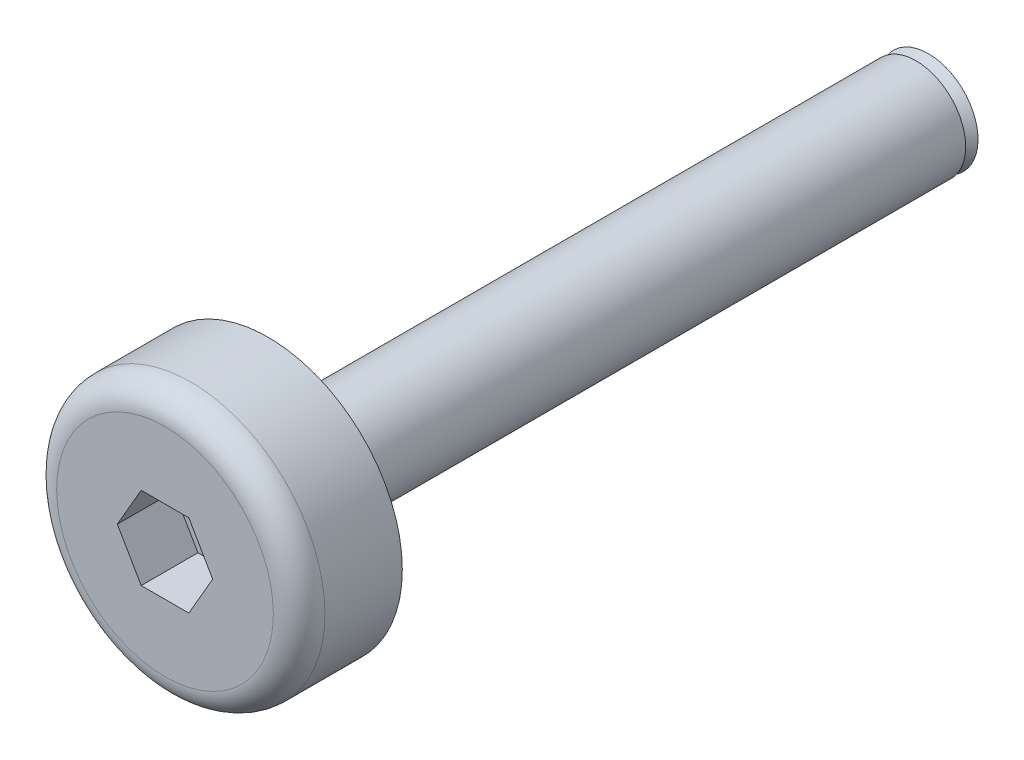
ISO-10303-21;
HEADER;
FILE_DESCRIPTION(('STEP AP214'),'2;1');
FILE_NAME('part.step','',(''),(''),'','','');
FILE_SCHEMA(('AUTOMOTIVE_DESIGN { 1 0 10303 214 1 1 1 1 }'));
ENDSEC;
DATA;
#1=APPLICATION_CONTEXT('core data for automotive mechanical design processes');
#2=APPLICATION_PROTOCOL_DEFINITION('international standard','automotive_design',2000,#1);
#3=PRODUCT_CONTEXT('',#1,'mechanical');
#4=PRODUCT('Part','Part','',(#3));
#5=PRODUCT_RELATED_PRODUCT_CATEGORY('part','',(#4));
#6=PRODUCT_DEFINITION_FORMATION('','',#4);
#7=PRODUCT_DEFINITION_CONTEXT('part definition',#1,'design');
#8=PRODUCT_DEFINITION('design','',#6,#7);
#9=PRODUCT_DEFINITION_SHAPE('','',#8);
#10=(LENGTH_UNIT() NAMED_UNIT(*) SI_UNIT(.MILLI.,.METRE.));
#11=(NAMED_UNIT(*) PLANE_ANGLE_UNIT() SI_UNIT($,.RADIAN.));
#12=(NAMED_UNIT(*) SI_UNIT($,.STERADIAN.) SOLID_ANGLE_UNIT());
#13=UNCERTAINTY_MEASURE_WITH_UNIT(LENGTH_MEASURE(1.E-05),#10,'distance_accuracy_value','');
#14=(GEOMETRIC_REPRESENTATION_CONTEXT(3) GLOBAL_UNCERTAINTY_ASSIGNED_CONTEXT((#13)) GLOBAL_UNIT_ASSIGNED_CONTEXT((#10,
#11,#12)) REPRESENTATION_CONTEXT('',''));
#15=CARTESIAN_POINT('',(0.,0.,0.));
#16=DIRECTION('',(0.,0.,1.));
#17=DIRECTION('',(1.,0.,0.));
#18=AXIS2_PLACEMENT_3D('',#15,#16,#17);
#19=CARTESIAN_POINT('',(0.,0.,2.5));
#20=DIRECTION('',(0.,0.,1.));
#21=DIRECTION('',(1.,0.,0.));
#22=AXIS2_PLACEMENT_3D('',#19,#20,#21);
#23=PLANE('',#22);
#24=CARTESIAN_POINT('',(0.,0.,2.5));
#25=DIRECTION('',(0.,0.,1.));
#26=DIRECTION('',(1.,0.,0.));
#27=AXIS2_PLACEMENT_3D('',#24,#25,#26);
#28=CIRCLE('',#27,2.625);
#29=CARTESIAN_POINT('',(2.625,0.,2.5));
#30=VERTEX_POINT('',#29);
#31=EDGE_CURVE('E142',#30,#30,#28,.T.);
#32=ORIENTED_EDGE('',*,*,#31,.T.);
#33=EDGE_LOOP('',(#32));
#34=FACE_BOUND('',#33,.T.);
#35=DIRECTION('',(0.5,-0.866025403784439,0.));
#36=VECTOR('',#35,1.);
#37=CARTESIAN_POINT('',(0.866025403784439,0.5,2.5));
#38=LINE('',#37,#36);
#39=CARTESIAN_POINT('',(0.577350269189626,1.,2.5));
#40=VERTEX_POINT('',#39);
#41=CARTESIAN_POINT('',(1.15470053837925,0.,2.5));
#42=VERTEX_POINT('',#41);
#43=EDGE_CURVE('E51',#40,#42,#38,.T.);
#44=ORIENTED_EDGE('',*,*,#43,.T.);
#45=DIRECTION('',(-0.5,-0.866025403784439,0.));
#46=VECTOR('',#45,1.);
#47=CARTESIAN_POINT('',(0.866025403784439,-0.5,2.5));
#48=LINE('',#47,#46);
#49=CARTESIAN_POINT('',(0.577350269189626,-1.,2.5));
#50=VERTEX_POINT('',#49);
#51=EDGE_CURVE('E11',#42,#50,#48,.T.);
#52=ORIENTED_EDGE('',*,*,#51,.T.);
#53=DIRECTION('',(-1.,0.,0.));
#54=VECTOR('',#53,1.);
#55=CARTESIAN_POINT('',(0.,-1.,2.5));
#56=LINE('',#55,#54);
#57=CARTESIAN_POINT('',(-0.577350269189626,-1.,2.5));
#58=VERTEX_POINT('',#57);
#59=EDGE_CURVE('E148',#50,#58,#56,.T.);
#60=ORIENTED_EDGE('',*,*,#59,.T.);
#61=DIRECTION('',(-0.5,0.866025403784439,0.));
#62=VECTOR('',#61,1.);
#63=CARTESIAN_POINT('',(-0.866025403784439,-0.5,2.5));
#64=LINE('',#63,#62);
#65=CARTESIAN_POINT('',(-1.15470053837925,0.,2.5));
#66=VERTEX_POINT('',#65);
#67=EDGE_CURVE('E151',#58,#66,#64,.T.);
#68=ORIENTED_EDGE('',*,*,#67,.T.);
#69=DIRECTION('',(0.5,0.866025403784439,0.));
#70=VECTOR('',#69,1.);
#71=CARTESIAN_POINT('',(-0.866025403784438,0.5,2.5));
#72=LINE('',#71,#70);
#73=CARTESIAN_POINT('',(-0.577350269189625,0.999999999999999,2.5));
#74=VERTEX_POINT('',#73);
#75=EDGE_CURVE('E154',#66,#74,#72,.T.);
#76=ORIENTED_EDGE('',*,*,#75,.T.);
#77=DIRECTION('',(1.,0.,0.));
#78=VECTOR('',#77,1.);
#79=CARTESIAN_POINT('',(0.,1.,2.5));
#80=LINE('',#79,#78);
#81=EDGE_CURVE('E157',#74,#40,#80,.T.);
#82=ORIENTED_EDGE('',*,*,#81,.T.);
#83=EDGE_LOOP('',(#44,#52,#60,#68,#76,#82));
#84=FACE_BOUND('',#83,.T.);
#85=ADVANCED_FACE('F43',(#34,#84),#23,.T.);
#86=CARTESIAN_POINT('',(0.,0.,2.5));
#87=DIRECTION('',(0.,0.,-1.));
#88=DIRECTION('',(-1.,0.,0.));
#89=AXIS2_PLACEMENT_3D('',#86,#87,#88);
#90=CYLINDRICAL_SURFACE('',#89,3.25);
#91=CARTESIAN_POINT('',(0.,0.,1.875));
#92=DIRECTION('',(0.,0.,1.));
#93=DIRECTION('',(1.,0.,0.));
#94=AXIS2_PLACEMENT_3D('',#91,#92,#93);
#95=CIRCLE('',#94,3.25);
#96=CARTESIAN_POINT('',(3.25,0.,1.875));
#97=VERTEX_POINT('',#96);
#98=EDGE_CURVE('E145',#97,#97,#95,.F.);
#99=ORIENTED_EDGE('',*,*,#98,.T.);
#100=EDGE_LOOP('',(#99));
#101=FACE_BOUND('',#100,.T.);
#102=CARTESIAN_POINT('',(0.,0.,0.));
#103=DIRECTION('',(0.,0.,1.));
#104=DIRECTION('',(1.,0.,0.));
#105=AXIS2_PLACEMENT_3D('',#102,#103,#104);
#106=CIRCLE('',#105,3.25);
#107=CARTESIAN_POINT('',(3.25,0.,0.));
#108=VERTEX_POINT('',#107);
#109=EDGE_CURVE('E100',#108,#108,#106,.T.);
#110=ORIENTED_EDGE('',*,*,#109,.T.);
#111=EDGE_LOOP('',(#110));
#112=FACE_BOUND('',#111,.T.);
#113=ADVANCED_FACE('F181',(#101,#112),#90,.T.);
#114=CARTESIAN_POINT('',(0.,0.,0.));
#115=DIRECTION('',(0.,0.,1.));
#116=DIRECTION('',(1.,0.,0.));
#117=AXIS2_PLACEMENT_3D('',#114,#115,#116);
#118=PLANE('',#117);
#119=CARTESIAN_POINT('',(0.,0.,0.));
#120=DIRECTION('',(0.,0.,1.));
#121=DIRECTION('',(1.,0.,0.));
#122=AXIS2_PLACEMENT_3D('',#119,#120,#121);
#123=CIRCLE('',#122,1.2);
#124=CARTESIAN_POINT('',(1.2,0.,0.));
#125=VERTEX_POINT('',#124);
#126=EDGE_CURVE('E119',#125,#125,#123,.T.);
#127=ORIENTED_EDGE('',*,*,#126,.T.);
#128=EDGE_LOOP('',(#127));
#129=FACE_BOUND('',#128,.T.);
#130=ORIENTED_EDGE('',*,*,#109,.F.);
#131=EDGE_LOOP('',(#130));
#132=FACE_BOUND('',#131,.T.);
#133=ADVANCED_FACE('F187',(#129,#132),#118,.F.);
#134=CARTESIAN_POINT('',(0.,0.,1.875));
#135=DIRECTION('',(0.,0.,1.));
#136=DIRECTION('',(1.,0.,0.));
#137=AXIS2_PLACEMENT_3D('',#134,#135,#136);
#138=TOROIDAL_SURFACE('',#137,2.625,0.625);
#139=ORIENTED_EDGE('',*,*,#98,.F.);
#140=EDGE_LOOP('',(#139));
#141=FACE_BOUND('',#140,.T.);
#142=ORIENTED_EDGE('',*,*,#31,.F.);
#143=EDGE_LOOP('',(#142));
#144=FACE_BOUND('',#143,.T.);
#145=ADVANCED_FACE('F45',(#141,#144),#138,.T.);
#146=CARTESIAN_POINT('',(0.577350269189626,-1.,2.51));
#147=DIRECTION('',(-0.866025403784439,0.5,0.));
#148=DIRECTION('',(-0.5,-0.866025403784439,0.));
#149=AXIS2_PLACEMENT_3D('',#146,#147,#148);
#150=PLANE('',#149);
#151=DIRECTION('',(0.,0.,-1.));
#152=VECTOR('',#151,1.);
#153=CARTESIAN_POINT('',(1.15470053837925,0.,2.51));
#154=LINE('',#153,#152);
#155=CARTESIAN_POINT('',(1.15470053837925,0.,1.125));
#156=VERTEX_POINT('',#155);
#157=EDGE_CURVE('E93',#42,#156,#154,.T.);
#158=ORIENTED_EDGE('',*,*,#157,.T.);
#159=DIRECTION('',(0.5,0.866025403784439,0.));
#160=VECTOR('',#159,1.);
#161=CARTESIAN_POINT('',(0.577350269189626,-1.,1.125));
#162=LINE('',#161,#160);
#163=CARTESIAN_POINT('',(0.577350269189626,-1.,1.125));
#164=VERTEX_POINT('',#163);
#165=EDGE_CURVE('E97',#164,#156,#162,.T.);
#166=ORIENTED_EDGE('',*,*,#165,.F.);
#167=DIRECTION('',(0.,0.,-1.));
#168=VECTOR('',#167,1.);
#169=CARTESIAN_POINT('',(0.577350269189626,-1.,2.51));
#170=LINE('',#169,#168);
#171=EDGE_CURVE('E132',#50,#164,#170,.T.);
#172=ORIENTED_EDGE('',*,*,#171,.F.);
#173=ORIENTED_EDGE('',*,*,#51,.F.);
#174=EDGE_LOOP('',(#158,#166,#172,#173));
#175=FACE_BOUND('',#174,.T.);
#176=ADVANCED_FACE('F95',(#175),#150,.T.);
#177=CARTESIAN_POINT('',(1.15470053837925,0.,2.51));
#178=DIRECTION('',(-0.866025403784439,-0.5,0.));
#179=DIRECTION('',(0.,0.,1.));
#180=AXIS2_PLACEMENT_3D('',#177,#178,#179);
#181=PLANE('',#180);
#182=DIRECTION('',(0.,0.,-1.));
#183=VECTOR('',#182,1.);
#184=CARTESIAN_POINT('',(0.577350269189626,1.,2.51));
#185=LINE('',#184,#183);
#186=CARTESIAN_POINT('',(0.577350269189626,1.,1.125));
#187=VERTEX_POINT('',#186);
#188=EDGE_CURVE('E101',#40,#187,#185,.T.);
#189=ORIENTED_EDGE('',*,*,#188,.T.);
#190=DIRECTION('',(-0.5,0.866025403784439,0.));
#191=VECTOR('',#190,1.);
#192=CARTESIAN_POINT('',(1.15470053837925,0.,1.125));
#193=LINE('',#192,#191);
#194=EDGE_CURVE('E104',#156,#187,#193,.T.);
#195=ORIENTED_EDGE('',*,*,#194,.F.);
#196=ORIENTED_EDGE('',*,*,#157,.F.);
#197=ORIENTED_EDGE('',*,*,#43,.F.);
#198=EDGE_LOOP('',(#189,#195,#196,#197));
#199=FACE_BOUND('',#198,.T.);
#200=ADVANCED_FACE('F105',(#199),#181,.T.);
#201=CARTESIAN_POINT('',(0.577350269189626,1.,2.51));
#202=DIRECTION('',(0.,-1.,0.));
#203=DIRECTION('',(1.,0.,0.));
#204=AXIS2_PLACEMENT_3D('',#201,#202,#203);
#205=PLANE('',#204);
#206=DIRECTION('',(0.,0.,-1.));
#207=VECTOR('',#206,1.);
#208=CARTESIAN_POINT('',(-0.577350269189625,0.999999999999999,2.51));
#209=LINE('',#208,#207);
#210=CARTESIAN_POINT('',(-0.577350269189625,0.999999999999999,1.125));
#211=VERTEX_POINT('',#210);
#212=EDGE_CURVE('E137',#74,#211,#209,.T.);
#213=ORIENTED_EDGE('',*,*,#212,.T.);
#214=DIRECTION('',(-1.,0.,0.));
#215=VECTOR('',#214,1.);
#216=CARTESIAN_POINT('',(0.577350269189626,1.,1.125));
#217=LINE('',#216,#215);
#218=EDGE_CURVE('E110',#187,#211,#217,.T.);
#219=ORIENTED_EDGE('',*,*,#218,.F.);
#220=ORIENTED_EDGE('',*,*,#188,.F.);
#221=ORIENTED_EDGE('',*,*,#81,.F.);
#222=EDGE_LOOP('',(#213,#219,#220,#221));
#223=FACE_BOUND('',#222,.T.);
#224=ADVANCED_FACE('F161',(#223),#205,.T.);
#225=CARTESIAN_POINT('',(-0.577350269189625,0.999999999999999,2.51));
#226=DIRECTION('',(0.866025403784439,-0.5,0.));
#227=DIRECTION('',(0.5,0.866025403784439,0.));
#228=AXIS2_PLACEMENT_3D('',#225,#226,#227);
#229=PLANE('',#228);
#230=DIRECTION('',(0.,0.,-1.));
#231=VECTOR('',#230,1.);
#232=CARTESIAN_POINT('',(-1.15470053837925,0.,2.51));
#233=LINE('',#232,#231);
#234=CARTESIAN_POINT('',(-1.15470053837925,0.,1.125));
#235=VERTEX_POINT('',#234);
#236=EDGE_CURVE('E135',#66,#235,#233,.T.);
#237=ORIENTED_EDGE('',*,*,#236,.T.);
#238=DIRECTION('',(-0.5,-0.866025403784439,0.));
#239=VECTOR('',#238,1.);
#240=CARTESIAN_POINT('',(-0.577350269189625,0.999999999999999,1.125));
#241=LINE('',#240,#239);
#242=EDGE_CURVE('E126',#211,#235,#241,.T.);
#243=ORIENTED_EDGE('',*,*,#242,.F.);
#244=ORIENTED_EDGE('',*,*,#212,.F.);
#245=ORIENTED_EDGE('',*,*,#75,.F.);
#246=EDGE_LOOP('',(#237,#243,#244,#245));
#247=FACE_BOUND('',#246,.T.);
#248=ADVANCED_FACE('F166',(#247),#229,.T.);
#249=CARTESIAN_POINT('',(-1.15470053837925,0.,2.51));
#250=DIRECTION('',(0.866025403784439,0.5,0.));
#251=DIRECTION('',(-0.5,0.866025403784439,0.));
#252=AXIS2_PLACEMENT_3D('',#249,#250,#251);
#253=PLANE('',#252);
#254=DIRECTION('',(0.,0.,-1.));
#255=VECTOR('',#254,1.);
#256=CARTESIAN_POINT('',(-0.577350269189626,-1.,2.51));
#257=LINE('',#256,#255);
#258=CARTESIAN_POINT('',(-0.577350269189626,-1.,1.125));
#259=VERTEX_POINT('',#258);
#260=EDGE_CURVE('E58',#58,#259,#257,.T.);
#261=ORIENTED_EDGE('',*,*,#260,.T.);
#262=DIRECTION('',(0.5,-0.866025403784439,0.));
#263=VECTOR('',#262,1.);
#264=CARTESIAN_POINT('',(-1.15470053837925,0.,1.125));
#265=LINE('',#264,#263);
#266=EDGE_CURVE('E129',#235,#259,#265,.T.);
#267=ORIENTED_EDGE('',*,*,#266,.F.);
#268=ORIENTED_EDGE('',*,*,#236,.F.);
#269=ORIENTED_EDGE('',*,*,#67,.F.);
#270=EDGE_LOOP('',(#261,#267,#268,#269));
#271=FACE_BOUND('',#270,.T.);
#272=ADVANCED_FACE('F169',(#271),#253,.T.);
#273=CARTESIAN_POINT('',(-0.577350269189626,-1.,2.51));
#274=DIRECTION('',(0.,1.,0.));
#275=DIRECTION('',(-1.,0.,0.));
#276=AXIS2_PLACEMENT_3D('',#273,#274,#275);
#277=PLANE('',#276);
#278=ORIENTED_EDGE('',*,*,#171,.T.);
#279=DIRECTION('',(1.,0.,0.));
#280=VECTOR('',#279,1.);
#281=CARTESIAN_POINT('',(-0.577350269189626,-1.,1.125));
#282=LINE('',#281,#280);
#283=EDGE_CURVE('E115',#259,#164,#282,.T.);
#284=ORIENTED_EDGE('',*,*,#283,.F.);
#285=ORIENTED_EDGE('',*,*,#260,.F.);
#286=ORIENTED_EDGE('',*,*,#59,.F.);
#287=EDGE_LOOP('',(#278,#284,#285,#286));
#288=FACE_BOUND('',#287,.T.);
#289=ADVANCED_FACE('F170',(#288),#277,.T.);
#290=CARTESIAN_POINT('',(1.15470053837925,0.,1.125));
#291=DIRECTION('',(0.,0.,1.));
#292=DIRECTION('',(-0.5,0.866025403784439,0.));
#293=AXIS2_PLACEMENT_3D('',#290,#291,#292);
#294=PLANE('',#293);
#295=ORIENTED_EDGE('',*,*,#165,.T.);
#296=ORIENTED_EDGE('',*,*,#194,.T.);
#297=ORIENTED_EDGE('',*,*,#218,.T.);
#298=ORIENTED_EDGE('',*,*,#242,.T.);
#299=ORIENTED_EDGE('',*,*,#266,.T.);
#300=ORIENTED_EDGE('',*,*,#283,.T.);
#301=EDGE_LOOP('',(#295,#296,#297,#298,#299,#300));
#302=FACE_BOUND('',#301,.T.);
#303=ADVANCED_FACE('F113',(#302),#294,.T.);
#304=CARTESIAN_POINT('',(0.,0.,0.));
#305=DIRECTION('',(0.,0.,-1.));
#306=DIRECTION('',(-1.,0.,0.));
#307=AXIS2_PLACEMENT_3D('',#304,#305,#306);
#308=CYLINDRICAL_SURFACE('',#307,1.2);
#309=ORIENTED_EDGE('',*,*,#126,.F.);
#310=EDGE_LOOP('',(#309));
#311=FACE_BOUND('',#310,.T.);
#312=CARTESIAN_POINT('',(0.,0.,-15.7));
#313=DIRECTION('',(0.,0.,1.));
#314=DIRECTION('',(1.,0.,0.));
#315=AXIS2_PLACEMENT_3D('',#312,#313,#314);
#316=CIRCLE('',#315,1.2);
#317=CARTESIAN_POINT('',(1.2,0.,-15.7));
#318=VERTEX_POINT('',#317);
#319=EDGE_CURVE('E122',#318,#318,#316,.T.);
#320=ORIENTED_EDGE('',*,*,#319,.T.);
#321=EDGE_LOOP('',(#320));
#322=FACE_BOUND('',#321,.T.);
#323=ADVANCED_FACE('F177',(#311,#322),#308,.T.);
#324=CARTESIAN_POINT('',(0.,0.,-15.7));
#325=DIRECTION('',(0.,0.,1.));
#326=DIRECTION('',(1.,0.,0.));
#327=AXIS2_PLACEMENT_3D('',#324,#325,#326);
#328=PLANE('',#327);
#329=CARTESIAN_POINT('',(0.,0.,-15.7));
#330=DIRECTION('',(0.,0.,-1.));
#331=DIRECTION('',(0.,1.,0.));
#332=AXIS2_PLACEMENT_3D('',#329,#330,#331);
#333=CIRCLE('',#332,0.9);
#334=CARTESIAN_POINT('',(0.,0.9,-15.7));
#335=VERTEX_POINT('',#334);
#336=EDGE_CURVE('E116',#335,#335,#333,.T.);
#337=ORIENTED_EDGE('',*,*,#336,.F.);
#338=EDGE_LOOP('',(#337));
#339=FACE_BOUND('',#338,.T.);
#340=ORIENTED_EDGE('',*,*,#319,.F.);
#341=EDGE_LOOP('',(#340));
#342=FACE_BOUND('',#341,.T.);
#343=ADVANCED_FACE('F219',(#339,#342),#328,.F.);
#344=CARTESIAN_POINT('',(0.,0.,-16.));
#345=DIRECTION('',(0.,0.,-1.));
#346=DIRECTION('',(0.,1.,0.));
#347=AXIS2_PLACEMENT_3D('',#344,#345,#346);
#348=PLANE('',#347);
#349=CARTESIAN_POINT('',(0.,0.,-16.));
#350=DIRECTION('',(0.,0.,-1.));
#351=DIRECTION('',(0.,1.,0.));
#352=AXIS2_PLACEMENT_3D('',#349,#350,#351);
#353=CIRCLE('',#352,1.2);
#354=CARTESIAN_POINT('',(0.,1.2,-16.));
#355=VERTEX_POINT('',#354);
#356=EDGE_CURVE('E205',#355,#355,#353,.T.);
#357=ORIENTED_EDGE('',*,*,#356,.T.);
#358=EDGE_LOOP('',(#357));
#359=FACE_BOUND('',#358,.T.);
#360=ADVANCED_FACE('F210',(#359),#348,.T.);
#361=CARTESIAN_POINT('',(0.,0.,-16.));
#362=DIRECTION('',(0.,0.,-1.));
#363=DIRECTION('',(0.,1.,0.));
#364=AXIS2_PLACEMENT_3D('',#361,#362,#363);
#365=CONICAL_SURFACE('',#364,1.2,0.785398163397457);
#366=ORIENTED_EDGE('',*,*,#336,.T.);
#367=EDGE_LOOP('',(#366));
#368=FACE_BOUND('',#367,.T.);
#369=ORIENTED_EDGE('',*,*,#356,.F.);
#370=EDGE_LOOP('',(#369));
#371=FACE_BOUND('',#370,.T.);
#372=ADVANCED_FACE('F212',(#368,#371),#365,.T.);
#373=CLOSED_SHELL('',(#85,#113,#133,#145,#176,#200,#224,#248,#272,#289,#303,#323,#343,#360,#372));
#374=MANIFOLD_SOLID_BREP('B2',#373);
#375=ADVANCED_BREP_SHAPE_REPRESENTATION('',(#18,#374),#14);
#376=SHAPE_DEFINITION_REPRESENTATION(#9,#375);
ENDSEC;
END-ISO-10303-21;
